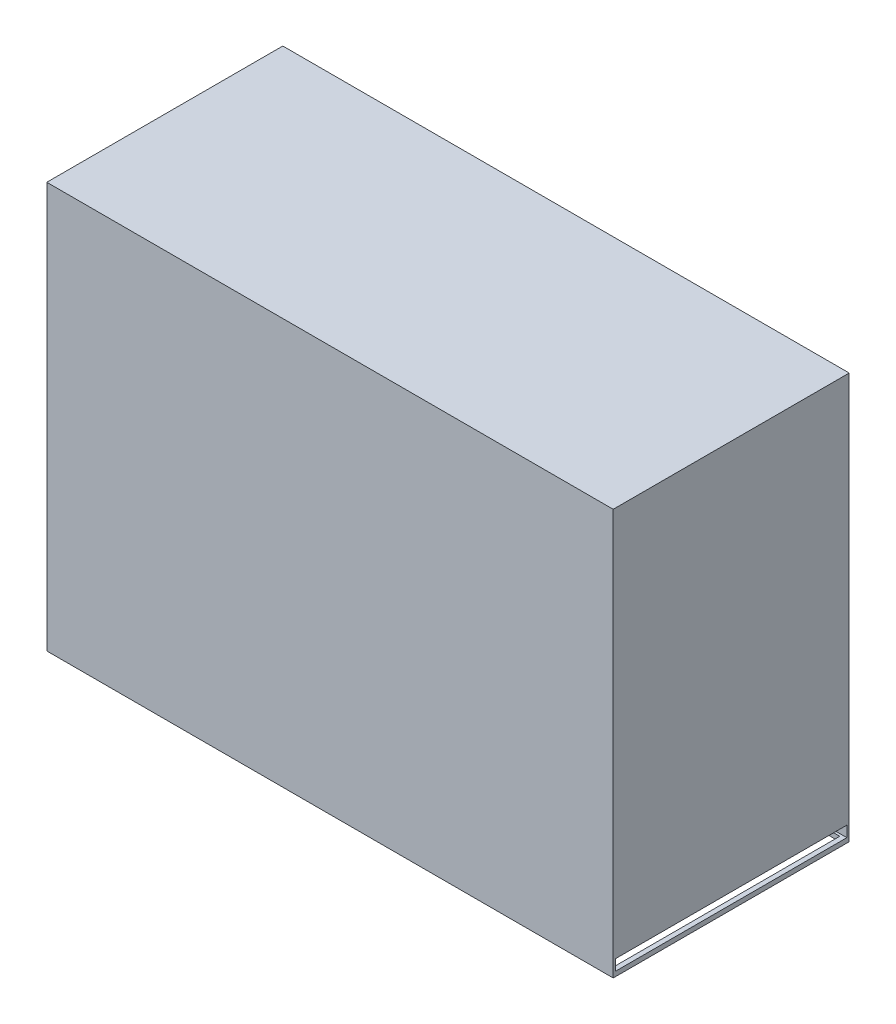
ISO-10303-21;
HEADER;
FILE_DESCRIPTION(('STEP AP214'),'2;1');
FILE_NAME('part.step','',(''),(''),'','','');
FILE_SCHEMA(('AUTOMOTIVE_DESIGN { 1 0 10303 214 1 1 1 1 }'));
ENDSEC;
DATA;
#1=APPLICATION_CONTEXT('core data for automotive mechanical design processes');
#2=APPLICATION_PROTOCOL_DEFINITION('international standard','automotive_design',2000,#1);
#3=PRODUCT_CONTEXT('',#1,'mechanical');
#4=PRODUCT('Part','Part','',(#3));
#5=PRODUCT_RELATED_PRODUCT_CATEGORY('part','',(#4));
#6=PRODUCT_DEFINITION_FORMATION('','',#4);
#7=PRODUCT_DEFINITION_CONTEXT('part definition',#1,'design');
#8=PRODUCT_DEFINITION('design','',#6,#7);
#9=PRODUCT_DEFINITION_SHAPE('','',#8);
#10=(LENGTH_UNIT() NAMED_UNIT(*) SI_UNIT(.MILLI.,.METRE.));
#11=(NAMED_UNIT(*) PLANE_ANGLE_UNIT() SI_UNIT($,.RADIAN.));
#12=(NAMED_UNIT(*) SI_UNIT($,.STERADIAN.) SOLID_ANGLE_UNIT());
#13=UNCERTAINTY_MEASURE_WITH_UNIT(LENGTH_MEASURE(1.E-05),#10,'distance_accuracy_value','');
#14=(GEOMETRIC_REPRESENTATION_CONTEXT(3) GLOBAL_UNCERTAINTY_ASSIGNED_CONTEXT((#13)) GLOBAL_UNIT_ASSIGNED_CONTEXT((#10,
#11,#12)) REPRESENTATION_CONTEXT('',''));
#15=CARTESIAN_POINT('',(0.,0.,0.));
#16=DIRECTION('',(0.,0.,1.));
#17=DIRECTION('',(1.,0.,0.));
#18=AXIS2_PLACEMENT_3D('',#15,#16,#17);
#19=CARTESIAN_POINT('',(1.,50.,49.));
#20=DIRECTION('',(0.,0.,1.));
#21=DIRECTION('',(1.,0.,0.));
#22=AXIS2_PLACEMENT_3D('',#19,#20,#21);
#23=PLANE('',#22);
#24=DIRECTION('',(0.,-1.,0.));
#25=VECTOR('',#24,1.);
#26=CARTESIAN_POINT('',(1.,50.,49.));
#27=LINE('',#26,#25);
#28=CARTESIAN_POINT('',(1.,-3.00000000000005,49.));
#29=VERTEX_POINT('',#28);
#30=CARTESIAN_POINT('',(1.,-4.,49.));
#31=VERTEX_POINT('',#30);
#32=EDGE_CURVE('E473',#29,#31,#27,.T.);
#33=ORIENTED_EDGE('',*,*,#32,.F.);
#34=DIRECTION('',(1.,0.,0.));
#35=VECTOR('',#34,1.);
#36=CARTESIAN_POINT('',(1.00000000000002,-3.00000000000004,49.));
#37=LINE('',#36,#35);
#38=CARTESIAN_POINT('',(119.,-3.,49.));
#39=VERTEX_POINT('',#38);
#40=EDGE_CURVE('E299',#29,#39,#37,.T.);
#41=ORIENTED_EDGE('',*,*,#40,.T.);
#42=DIRECTION('',(0.,-1.,0.));
#43=VECTOR('',#42,1.);
#44=CARTESIAN_POINT('',(119.,50.,49.));
#45=LINE('',#44,#43);
#46=CARTESIAN_POINT('',(119.,-4.,49.));
#47=VERTEX_POINT('',#46);
#48=EDGE_CURVE('E478',#39,#47,#45,.T.);
#49=ORIENTED_EDGE('',*,*,#48,.T.);
#50=DIRECTION('',(-1.,0.,0.));
#51=VECTOR('',#50,1.);
#52=CARTESIAN_POINT('',(1.,-4.,49.));
#53=LINE('',#52,#51);
#54=EDGE_CURVE('E315',#47,#31,#53,.T.);
#55=ORIENTED_EDGE('',*,*,#54,.T.);
#56=EDGE_LOOP('',(#33,#41,#49,#55));
#57=FACE_BOUND('',#56,.T.);
#58=ADVANCED_FACE('F41',(#57),#23,.F.);
#59=CARTESIAN_POINT('',(119.,50.,49.));
#60=DIRECTION('',(1.,0.,0.));
#61=DIRECTION('',(0.,0.,-1.));
#62=AXIS2_PLACEMENT_3D('',#59,#60,#61);
#63=PLANE('',#62);
#64=ORIENTED_EDGE('',*,*,#48,.F.);
#65=DIRECTION('',(0.,0.,-1.));
#66=VECTOR('',#65,1.);
#67=CARTESIAN_POINT('',(119.,-3.,49.));
#68=LINE('',#67,#66);
#69=CARTESIAN_POINT('',(119.,-3.,1.));
#70=VERTEX_POINT('',#69);
#71=EDGE_CURVE('E295',#39,#70,#68,.T.);
#72=ORIENTED_EDGE('',*,*,#71,.T.);
#73=DIRECTION('',(0.,-1.,0.));
#74=VECTOR('',#73,1.);
#75=CARTESIAN_POINT('',(119.,50.,1.));
#76=LINE('',#75,#74);
#77=CARTESIAN_POINT('',(119.,-4.,1.));
#78=VERTEX_POINT('',#77);
#79=EDGE_CURVE('E483',#70,#78,#76,.T.);
#80=ORIENTED_EDGE('',*,*,#79,.T.);
#81=DIRECTION('',(0.,0.,1.));
#82=VECTOR('',#81,1.);
#83=CARTESIAN_POINT('',(119.,-4.,49.));
#84=LINE('',#83,#82);
#85=EDGE_CURVE('E311',#78,#47,#84,.T.);
#86=ORIENTED_EDGE('',*,*,#85,.T.);
#87=EDGE_LOOP('',(#64,#72,#80,#86));
#88=FACE_BOUND('',#87,.T.);
#89=ADVANCED_FACE('F542',(#88),#63,.F.);
#90=CARTESIAN_POINT('',(1.00000000000001,50.,1.));
#91=DIRECTION('',(0.,0.,-1.));
#92=DIRECTION('',(-1.,0.,0.));
#93=AXIS2_PLACEMENT_3D('',#90,#91,#92);
#94=PLANE('',#93);
#95=ORIENTED_EDGE('',*,*,#79,.F.);
#96=DIRECTION('',(-1.,0.,0.));
#97=VECTOR('',#96,1.);
#98=CARTESIAN_POINT('',(1.00000000000002,-3.00000000000004,1.));
#99=LINE('',#98,#97);
#100=CARTESIAN_POINT('',(1.,-3.00000000000004,1.));
#101=VERTEX_POINT('',#100);
#102=EDGE_CURVE('E291',#70,#101,#99,.T.);
#103=ORIENTED_EDGE('',*,*,#102,.T.);
#104=DIRECTION('',(0.,-1.,0.));
#105=VECTOR('',#104,1.);
#106=CARTESIAN_POINT('',(1.00000000000001,50.,1.));
#107=LINE('',#106,#105);
#108=CARTESIAN_POINT('',(1.,-4.,1.));
#109=VERTEX_POINT('',#108);
#110=EDGE_CURVE('E468',#101,#109,#107,.T.);
#111=ORIENTED_EDGE('',*,*,#110,.T.);
#112=DIRECTION('',(1.,0.,0.));
#113=VECTOR('',#112,1.);
#114=CARTESIAN_POINT('',(1.,-4.,1.));
#115=LINE('',#114,#113);
#116=EDGE_CURVE('E307',#109,#78,#115,.T.);
#117=ORIENTED_EDGE('',*,*,#116,.T.);
#118=EDGE_LOOP('',(#95,#103,#111,#117));
#119=FACE_BOUND('',#118,.T.);
#120=ADVANCED_FACE('F549',(#119),#94,.F.);
#121=CARTESIAN_POINT('',(1.,50.,49.));
#122=DIRECTION('',(-1.,0.,0.));
#123=DIRECTION('',(0.,0.,1.));
#124=AXIS2_PLACEMENT_3D('',#121,#122,#123);
#125=PLANE('',#124);
#126=CARTESIAN_POINT('',(1.,50.,49.));
#127=VERTEX_POINT('',#126);
#128=CARTESIAN_POINT('',(1.,-0.700000000000046,49.));
#129=VERTEX_POINT('',#128);
#130=EDGE_CURVE('E469',#127,#129,#27,.T.);
#131=ORIENTED_EDGE('',*,*,#130,.T.);
#132=DIRECTION('',(0.,0.,1.));
#133=VECTOR('',#132,1.);
#134=CARTESIAN_POINT('',(1.,-0.700000000000041,0.5));
#135=LINE('',#134,#133);
#136=CARTESIAN_POINT('',(1.,-0.700000000000047,49.5));
#137=VERTEX_POINT('',#136);
#138=EDGE_CURVE('E243',#129,#137,#135,.T.);
#139=ORIENTED_EDGE('',*,*,#138,.T.);
#140=DIRECTION('',(0.,-1.,0.));
#141=VECTOR('',#140,1.);
#142=CARTESIAN_POINT('',(1.,-3.00000000000005,49.5));
#143=LINE('',#142,#141);
#144=CARTESIAN_POINT('',(1.,-3.00000000000005,49.5));
#145=VERTEX_POINT('',#144);
#146=EDGE_CURVE('E242',#137,#145,#143,.T.);
#147=ORIENTED_EDGE('',*,*,#146,.T.);
#148=DIRECTION('',(0.,0.,-1.));
#149=VECTOR('',#148,1.);
#150=CARTESIAN_POINT('',(1.,-3.00000000000004,0.5));
#151=LINE('',#150,#149);
#152=EDGE_CURVE('E235',#145,#29,#151,.T.);
#153=ORIENTED_EDGE('',*,*,#152,.T.);
#154=ORIENTED_EDGE('',*,*,#32,.T.);
#155=DIRECTION('',(0.,0.,-1.));
#156=VECTOR('',#155,1.);
#157=CARTESIAN_POINT('',(1.,-4.,49.));
#158=LINE('',#157,#156);
#159=EDGE_CURVE('E303',#31,#109,#158,.T.);
#160=ORIENTED_EDGE('',*,*,#159,.T.);
#161=ORIENTED_EDGE('',*,*,#110,.F.);
#162=CARTESIAN_POINT('',(1.,-3.00000000000004,0.5));
#163=VERTEX_POINT('',#162);
#164=EDGE_CURVE('E248',#101,#163,#151,.T.);
#165=ORIENTED_EDGE('',*,*,#164,.T.);
#166=DIRECTION('',(0.,1.,0.));
#167=VECTOR('',#166,1.);
#168=CARTESIAN_POINT('',(1.,-3.00000000000004,0.5));
#169=LINE('',#168,#167);
#170=CARTESIAN_POINT('',(1.,-0.700000000000041,0.5));
#171=VERTEX_POINT('',#170);
#172=EDGE_CURVE('E229',#163,#171,#169,.T.);
#173=ORIENTED_EDGE('',*,*,#172,.T.);
#174=CARTESIAN_POINT('',(1.00000000000001,-0.700000000000041,1.));
#175=VERTEX_POINT('',#174);
#176=EDGE_CURVE('E58',#171,#175,#135,.T.);
#177=ORIENTED_EDGE('',*,*,#176,.T.);
#178=CARTESIAN_POINT('',(1.00000000000001,50.,1.));
#179=VERTEX_POINT('',#178);
#180=EDGE_CURVE('E484',#179,#175,#107,.T.);
#181=ORIENTED_EDGE('',*,*,#180,.F.);
#182=DIRECTION('',(0.,0.,-1.));
#183=VECTOR('',#182,1.);
#184=CARTESIAN_POINT('',(1.,50.,49.));
#185=LINE('',#184,#183);
#186=CARTESIAN_POINT('',(1.00000000000001,50.,4.00000000000002));
#187=VERTEX_POINT('',#186);
#188=EDGE_CURVE('E450',#187,#179,#185,.T.);
#189=ORIENTED_EDGE('',*,*,#188,.F.);
#190=DIRECTION('',(0.,1.,0.));
#191=VECTOR('',#190,1.);
#192=CARTESIAN_POINT('',(1.00000000000001,48.15,4.00000000000002));
#193=LINE('',#192,#191);
#194=CARTESIAN_POINT('',(1.00000000000001,48.15,4.00000000000002));
#195=VERTEX_POINT('',#194);
#196=EDGE_CURVE('E353',#195,#187,#193,.T.);
#197=ORIENTED_EDGE('',*,*,#196,.F.);
#198=DIRECTION('',(0.,0.,-1.));
#199=VECTOR('',#198,1.);
#200=CARTESIAN_POINT('',(1.00000000000001,48.15,0.));
#201=LINE('',#200,#199);
#202=CARTESIAN_POINT('',(1.00000000000001,48.15,5.00000000000002));
#203=VERTEX_POINT('',#202);
#204=EDGE_CURVE('E335',#203,#195,#201,.T.);
#205=ORIENTED_EDGE('',*,*,#204,.F.);
#206=DIRECTION('',(0.,1.,0.));
#207=VECTOR('',#206,1.);
#208=CARTESIAN_POINT('',(1.00000000000001,48.15,5.00000000000002));
#209=LINE('',#208,#207);
#210=CARTESIAN_POINT('',(1.00000000000001,50.,5.00000000000002));
#211=VERTEX_POINT('',#210);
#212=EDGE_CURVE('E349',#203,#211,#209,.T.);
#213=ORIENTED_EDGE('',*,*,#212,.T.);
#214=CARTESIAN_POINT('',(1.,50.,29.));
#215=VERTEX_POINT('',#214);
#216=EDGE_CURVE('E451',#215,#211,#185,.T.);
#217=ORIENTED_EDGE('',*,*,#216,.F.);
#218=DIRECTION('',(0.,1.,0.));
#219=VECTOR('',#218,1.);
#220=CARTESIAN_POINT('',(1.,23.,29.));
#221=LINE('',#220,#219);
#222=CARTESIAN_POINT('',(1.,23.,29.));
#223=VERTEX_POINT('',#222);
#224=EDGE_CURVE('E447',#223,#215,#221,.T.);
#225=ORIENTED_EDGE('',*,*,#224,.F.);
#226=DIRECTION('',(0.,0.,-1.));
#227=VECTOR('',#226,1.);
#228=CARTESIAN_POINT('',(1.,23.,49.));
#229=LINE('',#228,#227);
#230=CARTESIAN_POINT('',(1.,23.,30.));
#231=VERTEX_POINT('',#230);
#232=EDGE_CURVE('E421',#231,#223,#229,.T.);
#233=ORIENTED_EDGE('',*,*,#232,.F.);
#234=DIRECTION('',(0.,-1.,0.));
#235=VECTOR('',#234,1.);
#236=CARTESIAN_POINT('',(1.,50.,30.));
#237=LINE('',#236,#235);
#238=CARTESIAN_POINT('',(1.,50.,30.));
#239=VERTEX_POINT('',#238);
#240=EDGE_CURVE('E411',#239,#231,#237,.T.);
#241=ORIENTED_EDGE('',*,*,#240,.F.);
#242=DIRECTION('',(0.,0.,-1.));
#243=VECTOR('',#242,1.);
#244=CARTESIAN_POINT('',(1.,50.,49.));
#245=LINE('',#244,#243);
#246=EDGE_CURVE('E401',#127,#239,#245,.T.);
#247=ORIENTED_EDGE('',*,*,#246,.F.);
#248=EDGE_LOOP('',(#131,#139,#147,#153,#154,#160,#161,#165,#173,#177,#181,#189,#197,#205,#213,
#217,#225,#233,#241,#247));
#249=FACE_BOUND('',#248,.T.);
#250=ADVANCED_FACE('F246',(#249),#125,.F.);
#251=CARTESIAN_POINT('',(0.,50.,0.));
#252=DIRECTION('',(0.,-1.,0.));
#253=DIRECTION('',(0.,0.,-1.));
#254=AXIS2_PLACEMENT_3D('',#251,#252,#253);
#255=PLANE('',#254);
#256=DIRECTION('',(-1.,0.,0.));
#257=VECTOR('',#256,1.);
#258=CARTESIAN_POINT('',(0.,50.,4.00000000000002));
#259=LINE('',#258,#257);
#260=CARTESIAN_POINT('',(119.,50.,4.00000000000002));
#261=VERTEX_POINT('',#260);
#262=EDGE_CURVE('E357',#261,#187,#259,.T.);
#263=ORIENTED_EDGE('',*,*,#262,.T.);
#264=ORIENTED_EDGE('',*,*,#188,.T.);
#265=DIRECTION('',(1.,0.,0.));
#266=VECTOR('',#265,1.);
#267=CARTESIAN_POINT('',(1.00000000000001,50.,1.));
#268=LINE('',#267,#266);
#269=CARTESIAN_POINT('',(119.,50.,1.));
#270=VERTEX_POINT('',#269);
#271=EDGE_CURVE('E455',#179,#270,#268,.T.);
#272=ORIENTED_EDGE('',*,*,#271,.T.);
#273=DIRECTION('',(0.,0.,1.));
#274=VECTOR('',#273,1.);
#275=CARTESIAN_POINT('',(119.,50.,49.));
#276=LINE('',#275,#274);
#277=EDGE_CURVE('E460',#270,#261,#276,.T.);
#278=ORIENTED_EDGE('',*,*,#277,.T.);
#279=EDGE_LOOP('',(#263,#264,#272,#278));
#280=FACE_BOUND('',#279,.T.);
#281=ADVANCED_FACE('F564',(#280),#255,.T.);
#282=ORIENTED_EDGE('',*,*,#216,.T.);
#283=DIRECTION('',(1.,0.,0.));
#284=VECTOR('',#283,1.);
#285=CARTESIAN_POINT('',(0.,50.,5.00000000000002));
#286=LINE('',#285,#284);
#287=CARTESIAN_POINT('',(119.,50.,5.00000000000001));
#288=VERTEX_POINT('',#287);
#289=EDGE_CURVE('E363',#211,#288,#286,.T.);
#290=ORIENTED_EDGE('',*,*,#289,.T.);
#291=CARTESIAN_POINT('',(119.,50.,49.));
#292=VERTEX_POINT('',#291);
#293=EDGE_CURVE('E459',#288,#292,#276,.T.);
#294=ORIENTED_EDGE('',*,*,#293,.T.);
#295=DIRECTION('',(-1.,0.,0.));
#296=VECTOR('',#295,1.);
#297=CARTESIAN_POINT('',(1.,50.,49.));
#298=LINE('',#297,#296);
#299=CARTESIAN_POINT('',(54.,50.,49.));
#300=VERTEX_POINT('',#299);
#301=EDGE_CURVE('E464',#292,#300,#298,.T.);
#302=ORIENTED_EDGE('',*,*,#301,.T.);
#303=DIRECTION('',(0.,0.,1.));
#304=VECTOR('',#303,1.);
#305=CARTESIAN_POINT('',(54.,50.,49.));
#306=LINE('',#305,#304);
#307=CARTESIAN_POINT('',(54.,50.,29.));
#308=VERTEX_POINT('',#307);
#309=EDGE_CURVE('E425',#308,#300,#306,.T.);
#310=ORIENTED_EDGE('',*,*,#309,.F.);
#311=DIRECTION('',(1.,0.,0.));
#312=VECTOR('',#311,1.);
#313=CARTESIAN_POINT('',(1.,50.,29.));
#314=LINE('',#313,#312);
#315=EDGE_CURVE('E414',#215,#308,#314,.T.);
#316=ORIENTED_EDGE('',*,*,#315,.F.);
#317=EDGE_LOOP('',(#282,#290,#294,#302,#310,#316));
#318=FACE_BOUND('',#317,.T.);
#319=ADVANCED_FACE('F557',(#318),#255,.T.);
#320=CARTESIAN_POINT('',(119.,-0.700000000000006,49.));
#321=VERTEX_POINT('',#320);
#322=EDGE_CURVE('E474',#292,#321,#45,.T.);
#323=ORIENTED_EDGE('',*,*,#322,.T.);
#324=DIRECTION('',(-1.,0.,0.));
#325=VECTOR('',#324,1.);
#326=CARTESIAN_POINT('',(1.00000000000002,-0.700000000000048,49.));
#327=LINE('',#326,#325);
#328=EDGE_CURVE('E287',#321,#129,#327,.T.);
#329=ORIENTED_EDGE('',*,*,#328,.T.);
#330=ORIENTED_EDGE('',*,*,#130,.F.);
#331=DIRECTION('',(1.,0.,0.));
#332=VECTOR('',#331,1.);
#333=CARTESIAN_POINT('',(1.,50.,49.));
#334=LINE('',#333,#332);
#335=CARTESIAN_POINT('',(53.,50.,49.));
#336=VERTEX_POINT('',#335);
#337=EDGE_CURVE('E398',#127,#336,#334,.T.);
#338=ORIENTED_EDGE('',*,*,#337,.T.);
#339=DIRECTION('',(0.,-1.,0.));
#340=VECTOR('',#339,1.);
#341=CARTESIAN_POINT('',(53.,50.,49.));
#342=LINE('',#341,#340);
#343=CARTESIAN_POINT('',(53.,23.,49.));
#344=VERTEX_POINT('',#343);
#345=EDGE_CURVE('E415',#336,#344,#342,.T.);
#346=ORIENTED_EDGE('',*,*,#345,.T.);
#347=DIRECTION('',(-1.,0.,0.));
#348=VECTOR('',#347,1.);
#349=CARTESIAN_POINT('',(1.,23.,49.));
#350=LINE('',#349,#348);
#351=CARTESIAN_POINT('',(54.,23.,49.));
#352=VERTEX_POINT('',#351);
#353=EDGE_CURVE('E431',#352,#344,#350,.T.);
#354=ORIENTED_EDGE('',*,*,#353,.F.);
#355=DIRECTION('',(0.,1.,0.));
#356=VECTOR('',#355,1.);
#357=CARTESIAN_POINT('',(54.,23.,49.));
#358=LINE('',#357,#356);
#359=EDGE_CURVE('E435',#352,#300,#358,.T.);
#360=ORIENTED_EDGE('',*,*,#359,.T.);
#361=ORIENTED_EDGE('',*,*,#301,.F.);
#362=EDGE_LOOP('',(#323,#329,#330,#338,#346,#354,#360,#361));
#363=FACE_BOUND('',#362,.T.);
#364=ADVANCED_FACE('F545',(#363),#23,.F.);
#365=CARTESIAN_POINT('',(0.,0.,50.));
#366=DIRECTION('',(0.,1.,0.));
#367=DIRECTION('',(0.,0.,1.));
#368=AXIS2_PLACEMENT_3D('',#365,#366,#367);
#369=PLANE('',#368);
#370=DIRECTION('',(-1.,0.,0.));
#371=VECTOR('',#370,1.);
#372=CARTESIAN_POINT('',(0.,0.,4.00000000000002));
#373=LINE('',#372,#371);
#374=CARTESIAN_POINT('',(119.,0.,4.00000000000002));
#375=VERTEX_POINT('',#374);
#376=CARTESIAN_POINT('',(114.,0.,4.00000000000002));
#377=VERTEX_POINT('',#376);
#378=EDGE_CURVE('E358',#375,#377,#373,.T.);
#379=ORIENTED_EDGE('',*,*,#378,.F.);
#380=DIRECTION('',(0.,0.,1.));
#381=VECTOR('',#380,1.);
#382=CARTESIAN_POINT('',(119.,0.,49.));
#383=LINE('',#382,#381);
#384=CARTESIAN_POINT('',(119.,0.,5.00000000000002));
#385=VERTEX_POINT('',#384);
#386=EDGE_CURVE('E11',#375,#385,#383,.T.);
#387=ORIENTED_EDGE('',*,*,#386,.T.);
#388=DIRECTION('',(1.,0.,0.));
#389=VECTOR('',#388,1.);
#390=CARTESIAN_POINT('',(0.,0.,5.00000000000002));
#391=LINE('',#390,#389);
#392=CARTESIAN_POINT('',(114.,0.,5.00000000000002));
#393=VERTEX_POINT('',#392);
#394=EDGE_CURVE('E362',#393,#385,#391,.T.);
#395=ORIENTED_EDGE('',*,*,#394,.F.);
#396=DIRECTION('',(0.,0.,-1.));
#397=VECTOR('',#396,1.);
#398=CARTESIAN_POINT('',(114.,0.,0.));
#399=LINE('',#398,#397);
#400=EDGE_CURVE('E367',#393,#377,#399,.T.);
#401=ORIENTED_EDGE('',*,*,#400,.T.);
#402=EDGE_LOOP('',(#379,#387,#395,#401));
#403=FACE_BOUND('',#402,.T.);
#404=ADVANCED_FACE('F556',(#403),#369,.F.);
#405=CARTESIAN_POINT('',(119.,-0.700000000000001,1.));
#406=VERTEX_POINT('',#405);
#407=EDGE_CURVE('E479',#270,#406,#76,.T.);
#408=ORIENTED_EDGE('',*,*,#407,.T.);
#409=DIRECTION('',(0.,0.,1.));
#410=VECTOR('',#409,1.);
#411=CARTESIAN_POINT('',(119.,-0.700000000000006,49.));
#412=LINE('',#411,#410);
#413=EDGE_CURVE('E283',#406,#321,#412,.T.);
#414=ORIENTED_EDGE('',*,*,#413,.T.);
#415=ORIENTED_EDGE('',*,*,#322,.F.);
#416=ORIENTED_EDGE('',*,*,#293,.F.);
#417=DIRECTION('',(0.,1.,0.));
#418=VECTOR('',#417,1.);
#419=CARTESIAN_POINT('',(119.,0.,5.00000000000002));
#420=LINE('',#419,#418);
#421=EDGE_CURVE('E382',#385,#288,#420,.T.);
#422=ORIENTED_EDGE('',*,*,#421,.F.);
#423=ORIENTED_EDGE('',*,*,#386,.F.);
#424=DIRECTION('',(0.,1.,0.));
#425=VECTOR('',#424,1.);
#426=CARTESIAN_POINT('',(119.,0.,4.00000000000002));
#427=LINE('',#426,#425);
#428=EDGE_CURVE('E386',#375,#261,#427,.T.);
#429=ORIENTED_EDGE('',*,*,#428,.T.);
#430=ORIENTED_EDGE('',*,*,#277,.F.);
#431=EDGE_LOOP('',(#408,#414,#415,#416,#422,#423,#429,#430));
#432=FACE_BOUND('',#431,.T.);
#433=ADVANCED_FACE('F552',(#432),#63,.F.);
#434=ORIENTED_EDGE('',*,*,#180,.T.);
#435=DIRECTION('',(1.,0.,0.));
#436=VECTOR('',#435,1.);
#437=CARTESIAN_POINT('',(1.00000000000002,-0.700000000000041,1.));
#438=LINE('',#437,#436);
#439=EDGE_CURVE('E239',#175,#406,#438,.T.);
#440=ORIENTED_EDGE('',*,*,#439,.T.);
#441=ORIENTED_EDGE('',*,*,#407,.F.);
#442=ORIENTED_EDGE('',*,*,#271,.F.);
#443=EDGE_LOOP('',(#434,#440,#441,#442));
#444=FACE_BOUND('',#443,.T.);
#445=ADVANCED_FACE('F573',(#444),#94,.F.);
#446=CARTESIAN_POINT('',(1.,23.,29.));
#447=DIRECTION('',(0.,0.,1.));
#448=DIRECTION('',(1.,0.,0.));
#449=AXIS2_PLACEMENT_3D('',#446,#447,#448);
#450=PLANE('',#449);
#451=ORIENTED_EDGE('',*,*,#315,.T.);
#452=DIRECTION('',(0.,1.,0.));
#453=VECTOR('',#452,1.);
#454=CARTESIAN_POINT('',(54.,23.,29.));
#455=LINE('',#454,#453);
#456=CARTESIAN_POINT('',(54.,23.,29.));
#457=VERTEX_POINT('',#456);
#458=EDGE_CURVE('E444',#457,#308,#455,.T.);
#459=ORIENTED_EDGE('',*,*,#458,.F.);
#460=DIRECTION('',(1.,0.,0.));
#461=VECTOR('',#460,1.);
#462=CARTESIAN_POINT('',(1.,23.,29.));
#463=LINE('',#462,#461);
#464=EDGE_CURVE('E424',#223,#457,#463,.T.);
#465=ORIENTED_EDGE('',*,*,#464,.F.);
#466=ORIENTED_EDGE('',*,*,#224,.T.);
#467=EDGE_LOOP('',(#451,#459,#465,#466));
#468=FACE_BOUND('',#467,.T.);
#469=ADVANCED_FACE('F623',(#468),#450,.F.);
#470=CARTESIAN_POINT('',(54.,23.,49.));
#471=DIRECTION('',(-1.,0.,0.));
#472=DIRECTION('',(0.,0.,1.));
#473=AXIS2_PLACEMENT_3D('',#470,#471,#472);
#474=PLANE('',#473);
#475=ORIENTED_EDGE('',*,*,#309,.T.);
#476=ORIENTED_EDGE('',*,*,#359,.F.);
#477=DIRECTION('',(0.,0.,1.));
#478=VECTOR('',#477,1.);
#479=CARTESIAN_POINT('',(54.,23.,49.));
#480=LINE('',#479,#478);
#481=EDGE_CURVE('E428',#457,#352,#480,.T.);
#482=ORIENTED_EDGE('',*,*,#481,.F.);
#483=ORIENTED_EDGE('',*,*,#458,.T.);
#484=EDGE_LOOP('',(#475,#476,#482,#483));
#485=FACE_BOUND('',#484,.T.);
#486=ADVANCED_FACE('F628',(#485),#474,.F.);
#487=CARTESIAN_POINT('',(0.,23.,0.));
#488=DIRECTION('',(0.,-1.,0.));
#489=DIRECTION('',(0.,0.,-1.));
#490=AXIS2_PLACEMENT_3D('',#487,#488,#489);
#491=PLANE('',#490);
#492=DIRECTION('',(1.,0.,0.));
#493=VECTOR('',#492,1.);
#494=CARTESIAN_POINT('',(1.,23.,30.));
#495=LINE('',#494,#493);
#496=CARTESIAN_POINT('',(53.,23.,30.));
#497=VERTEX_POINT('',#496);
#498=EDGE_CURVE('E389',#231,#497,#495,.T.);
#499=ORIENTED_EDGE('',*,*,#498,.F.);
#500=ORIENTED_EDGE('',*,*,#232,.T.);
#501=ORIENTED_EDGE('',*,*,#464,.T.);
#502=ORIENTED_EDGE('',*,*,#481,.T.);
#503=ORIENTED_EDGE('',*,*,#353,.T.);
#504=DIRECTION('',(0.,0.,-1.));
#505=VECTOR('',#504,1.);
#506=CARTESIAN_POINT('',(53.,23.,49.));
#507=LINE('',#506,#505);
#508=EDGE_CURVE('E395',#344,#497,#507,.T.);
#509=ORIENTED_EDGE('',*,*,#508,.T.);
#510=EDGE_LOOP('',(#499,#500,#501,#502,#503,#509));
#511=FACE_BOUND('',#510,.T.);
#512=ADVANCED_FACE('F617',(#511),#491,.T.);
#513=CARTESIAN_POINT('',(1.,50.,30.));
#514=DIRECTION('',(0.,0.,-1.));
#515=DIRECTION('',(-1.,0.,0.));
#516=AXIS2_PLACEMENT_3D('',#513,#514,#515);
#517=PLANE('',#516);
#518=ORIENTED_EDGE('',*,*,#498,.T.);
#519=DIRECTION('',(0.,-1.,0.));
#520=VECTOR('',#519,1.);
#521=CARTESIAN_POINT('',(53.,50.,30.));
#522=LINE('',#521,#520);
#523=CARTESIAN_POINT('',(53.,50.,30.));
#524=VERTEX_POINT('',#523);
#525=EDGE_CURVE('E405',#524,#497,#522,.T.);
#526=ORIENTED_EDGE('',*,*,#525,.F.);
#527=DIRECTION('',(1.,0.,0.));
#528=VECTOR('',#527,1.);
#529=CARTESIAN_POINT('',(1.,50.,30.));
#530=LINE('',#529,#528);
#531=EDGE_CURVE('E390',#239,#524,#530,.T.);
#532=ORIENTED_EDGE('',*,*,#531,.F.);
#533=ORIENTED_EDGE('',*,*,#240,.T.);
#534=EDGE_LOOP('',(#518,#526,#532,#533));
#535=FACE_BOUND('',#534,.T.);
#536=ADVANCED_FACE('F613',(#535),#517,.F.);
#537=CARTESIAN_POINT('',(53.,50.,49.));
#538=DIRECTION('',(-1.,0.,0.));
#539=DIRECTION('',(0.,0.,1.));
#540=AXIS2_PLACEMENT_3D('',#537,#538,#539);
#541=PLANE('',#540);
#542=ORIENTED_EDGE('',*,*,#508,.F.);
#543=ORIENTED_EDGE('',*,*,#345,.F.);
#544=DIRECTION('',(0.,0.,-1.));
#545=VECTOR('',#544,1.);
#546=CARTESIAN_POINT('',(53.,50.,49.));
#547=LINE('',#546,#545);
#548=EDGE_CURVE('E394',#336,#524,#547,.T.);
#549=ORIENTED_EDGE('',*,*,#548,.T.);
#550=ORIENTED_EDGE('',*,*,#525,.T.);
#551=EDGE_LOOP('',(#542,#543,#549,#550));
#552=FACE_BOUND('',#551,.T.);
#553=ADVANCED_FACE('F611',(#552),#541,.T.);
#554=CARTESIAN_POINT('',(0.,50.,0.));
#555=DIRECTION('',(0.,1.,0.));
#556=DIRECTION('',(0.,0.,1.));
#557=AXIS2_PLACEMENT_3D('',#554,#555,#556);
#558=PLANE('',#557);
#559=ORIENTED_EDGE('',*,*,#531,.T.);
#560=ORIENTED_EDGE('',*,*,#548,.F.);
#561=ORIENTED_EDGE('',*,*,#337,.F.);
#562=ORIENTED_EDGE('',*,*,#246,.T.);
#563=EDGE_LOOP('',(#559,#560,#561,#562));
#564=FACE_BOUND('',#563,.T.);
#565=ADVANCED_FACE('F606',(#564),#558,.F.);
#566=CARTESIAN_POINT('',(0.,0.,4.00000000000002));
#567=DIRECTION('',(0.,0.,-1.));
#568=DIRECTION('',(-1.,0.,0.));
#569=AXIS2_PLACEMENT_3D('',#566,#567,#568);
#570=PLANE('',#569);
#571=ORIENTED_EDGE('',*,*,#262,.F.);
#572=ORIENTED_EDGE('',*,*,#428,.F.);
#573=ORIENTED_EDGE('',*,*,#378,.T.);
#574=DIRECTION('',(0.,1.,0.));
#575=VECTOR('',#574,1.);
#576=CARTESIAN_POINT('',(114.,0.,4.00000000000002));
#577=LINE('',#576,#575);
#578=CARTESIAN_POINT('',(114.,48.15,4.00000000000002));
#579=VERTEX_POINT('',#578);
#580=EDGE_CURVE('E370',#377,#579,#577,.T.);
#581=ORIENTED_EDGE('',*,*,#580,.T.);
#582=DIRECTION('',(1.,0.,0.));
#583=VECTOR('',#582,1.);
#584=CARTESIAN_POINT('',(0.,48.15,4.00000000000002));
#585=LINE('',#584,#583);
#586=EDGE_CURVE('E339',#195,#579,#585,.T.);
#587=ORIENTED_EDGE('',*,*,#586,.F.);
#588=ORIENTED_EDGE('',*,*,#196,.T.);
#589=EDGE_LOOP('',(#571,#572,#573,#581,#587,#588));
#590=FACE_BOUND('',#589,.T.);
#591=ADVANCED_FACE('F648',(#590),#570,.T.);
#592=CARTESIAN_POINT('',(0.,0.,5.00000000000002));
#593=DIRECTION('',(0.,0.,1.));
#594=DIRECTION('',(1.,0.,0.));
#595=AXIS2_PLACEMENT_3D('',#592,#593,#594);
#596=PLANE('',#595);
#597=ORIENTED_EDGE('',*,*,#289,.F.);
#598=ORIENTED_EDGE('',*,*,#212,.F.);
#599=DIRECTION('',(-1.,0.,0.));
#600=VECTOR('',#599,1.);
#601=CARTESIAN_POINT('',(0.,48.15,5.00000000000002));
#602=LINE('',#601,#600);
#603=CARTESIAN_POINT('',(114.,48.15,5.00000000000002));
#604=VERTEX_POINT('',#603);
#605=EDGE_CURVE('E346',#604,#203,#602,.T.);
#606=ORIENTED_EDGE('',*,*,#605,.F.);
#607=DIRECTION('',(0.,1.,0.));
#608=VECTOR('',#607,1.);
#609=CARTESIAN_POINT('',(114.,0.,5.00000000000002));
#610=LINE('',#609,#608);
#611=EDGE_CURVE('E378',#393,#604,#610,.T.);
#612=ORIENTED_EDGE('',*,*,#611,.F.);
#613=ORIENTED_EDGE('',*,*,#394,.T.);
#614=ORIENTED_EDGE('',*,*,#421,.T.);
#615=EDGE_LOOP('',(#597,#598,#606,#612,#613,#614));
#616=FACE_BOUND('',#615,.T.);
#617=ADVANCED_FACE('F655',(#616),#596,.T.);
#618=CARTESIAN_POINT('',(114.,0.,0.));
#619=DIRECTION('',(1.,0.,0.));
#620=DIRECTION('',(0.,0.,-1.));
#621=AXIS2_PLACEMENT_3D('',#618,#619,#620);
#622=PLANE('',#621);
#623=ORIENTED_EDGE('',*,*,#611,.T.);
#624=DIRECTION('',(0.,0.,-1.));
#625=VECTOR('',#624,1.);
#626=CARTESIAN_POINT('',(114.,48.15,0.));
#627=LINE('',#626,#625);
#628=EDGE_CURVE('E342',#604,#579,#627,.T.);
#629=ORIENTED_EDGE('',*,*,#628,.T.);
#630=ORIENTED_EDGE('',*,*,#580,.F.);
#631=ORIENTED_EDGE('',*,*,#400,.F.);
#632=EDGE_LOOP('',(#623,#629,#630,#631));
#633=FACE_BOUND('',#632,.T.);
#634=ADVANCED_FACE('F660',(#633),#622,.F.);
#635=CARTESIAN_POINT('',(0.,48.15,0.));
#636=DIRECTION('',(0.,-1.,0.));
#637=DIRECTION('',(0.,0.,-1.));
#638=AXIS2_PLACEMENT_3D('',#635,#636,#637);
#639=PLANE('',#638);
#640=ORIENTED_EDGE('',*,*,#204,.T.);
#641=ORIENTED_EDGE('',*,*,#586,.T.);
#642=ORIENTED_EDGE('',*,*,#628,.F.);
#643=ORIENTED_EDGE('',*,*,#605,.T.);
#644=EDGE_LOOP('',(#640,#641,#642,#643));
#645=FACE_BOUND('',#644,.T.);
#646=ADVANCED_FACE('F652',(#645),#639,.T.);
#647=CARTESIAN_POINT('',(0.,-4.,0.));
#648=DIRECTION('',(0.,-1.,0.));
#649=DIRECTION('',(0.,0.,-1.));
#650=AXIS2_PLACEMENT_3D('',#647,#648,#649);
#651=PLANE('',#650);
#652=DIRECTION('',(0.,0.,-1.));
#653=VECTOR('',#652,1.);
#654=CARTESIAN_POINT('',(0.,-4.,50.));
#655=LINE('',#654,#653);
#656=CARTESIAN_POINT('',(0.,-4.,50.));
#657=VERTEX_POINT('',#656);
#658=CARTESIAN_POINT('',(0.,-4.,0.));
#659=VERTEX_POINT('',#658);
#660=EDGE_CURVE('E318',#657,#659,#655,.T.);
#661=ORIENTED_EDGE('',*,*,#660,.T.);
#662=DIRECTION('',(1.,0.,0.));
#663=VECTOR('',#662,1.);
#664=CARTESIAN_POINT('',(0.,-4.,0.));
#665=LINE('',#664,#663);
#666=CARTESIAN_POINT('',(120.,-4.,0.));
#667=VERTEX_POINT('',#666);
#668=EDGE_CURVE('E323',#659,#667,#665,.T.);
#669=ORIENTED_EDGE('',*,*,#668,.T.);
#670=DIRECTION('',(0.,0.,1.));
#671=VECTOR('',#670,1.);
#672=CARTESIAN_POINT('',(120.,-4.,50.));
#673=LINE('',#672,#671);
#674=CARTESIAN_POINT('',(120.,-4.,50.));
#675=VERTEX_POINT('',#674);
#676=EDGE_CURVE('E327',#667,#675,#673,.T.);
#677=ORIENTED_EDGE('',*,*,#676,.T.);
#678=DIRECTION('',(-1.,0.,0.));
#679=VECTOR('',#678,1.);
#680=CARTESIAN_POINT('',(0.,-4.,50.));
#681=LINE('',#680,#679);
#682=EDGE_CURVE('E331',#675,#657,#681,.T.);
#683=ORIENTED_EDGE('',*,*,#682,.T.);
#684=EDGE_LOOP('',(#661,#669,#677,#683));
#685=FACE_BOUND('',#684,.T.);
#686=ORIENTED_EDGE('',*,*,#116,.F.);
#687=ORIENTED_EDGE('',*,*,#159,.F.);
#688=ORIENTED_EDGE('',*,*,#54,.F.);
#689=ORIENTED_EDGE('',*,*,#85,.F.);
#690=EDGE_LOOP('',(#686,#687,#688,#689));
#691=FACE_BOUND('',#690,.T.);
#692=ADVANCED_FACE('F523',(#685,#691),#651,.T.);
#693=CARTESIAN_POINT('',(0.,82.,50.));
#694=DIRECTION('',(0.,-1.,0.));
#695=DIRECTION('',(0.,0.,-1.));
#696=AXIS2_PLACEMENT_3D('',#693,#694,#695);
#697=PLANE('',#696);
#698=DIRECTION('',(-1.,0.,0.));
#699=VECTOR('',#698,1.);
#700=CARTESIAN_POINT('',(0.,82.,0.));
#701=LINE('',#700,#699);
#702=CARTESIAN_POINT('',(120.,82.,0.));
#703=VERTEX_POINT('',#702);
#704=CARTESIAN_POINT('',(0.,82.,0.));
#705=VERTEX_POINT('',#704);
#706=EDGE_CURVE('E491',#703,#705,#701,.T.);
#707=ORIENTED_EDGE('',*,*,#706,.T.);
#708=DIRECTION('',(0.,0.,-1.));
#709=VECTOR('',#708,1.);
#710=CARTESIAN_POINT('',(0.,82.,50.));
#711=LINE('',#710,#709);
#712=CARTESIAN_POINT('',(0.,82.,50.));
#713=VERTEX_POINT('',#712);
#714=EDGE_CURVE('E497',#713,#705,#711,.T.);
#715=ORIENTED_EDGE('',*,*,#714,.F.);
#716=DIRECTION('',(-1.,0.,0.));
#717=VECTOR('',#716,1.);
#718=CARTESIAN_POINT('',(0.,82.,50.));
#719=LINE('',#718,#717);
#720=CARTESIAN_POINT('',(120.,82.,50.));
#721=VERTEX_POINT('',#720);
#722=EDGE_CURVE('E494',#721,#713,#719,.T.);
#723=ORIENTED_EDGE('',*,*,#722,.F.);
#724=DIRECTION('',(0.,0.,-1.));
#725=VECTOR('',#724,1.);
#726=CARTESIAN_POINT('',(120.,82.,50.));
#727=LINE('',#726,#725);
#728=EDGE_CURVE('E45',#721,#703,#727,.T.);
#729=ORIENTED_EDGE('',*,*,#728,.T.);
#730=EDGE_LOOP('',(#707,#715,#723,#729));
#731=FACE_BOUND('',#730,.T.);
#732=ADVANCED_FACE('F516',(#731),#697,.F.);
#733=CARTESIAN_POINT('',(0.,0.,50.));
#734=DIRECTION('',(1.,0.,0.));
#735=DIRECTION('',(0.,1.,0.));
#736=AXIS2_PLACEMENT_3D('',#733,#734,#735);
#737=PLANE('',#736);
#738=DIRECTION('',(0.,-1.,0.));
#739=VECTOR('',#738,1.);
#740=CARTESIAN_POINT('',(0.,0.,0.));
#741=LINE('',#740,#739);
#742=EDGE_CURVE('E472',#705,#659,#741,.T.);
#743=ORIENTED_EDGE('',*,*,#742,.T.);
#744=ORIENTED_EDGE('',*,*,#660,.F.);
#745=DIRECTION('',(0.,-1.,0.));
#746=VECTOR('',#745,1.);
#747=CARTESIAN_POINT('',(0.,0.,50.));
#748=LINE('',#747,#746);
#749=EDGE_CURVE('E487',#713,#657,#748,.T.);
#750=ORIENTED_EDGE('',*,*,#749,.F.);
#751=ORIENTED_EDGE('',*,*,#714,.T.);
#752=EDGE_LOOP('',(#743,#744,#750,#751));
#753=FACE_BOUND('',#752,.T.);
#754=ADVANCED_FACE('F43',(#753),#737,.F.);
#755=CARTESIAN_POINT('',(0.,0.,50.));
#756=DIRECTION('',(0.,0.,-1.));
#757=DIRECTION('',(-1.,0.,0.));
#758=AXIS2_PLACEMENT_3D('',#755,#756,#757);
#759=PLANE('',#758);
#760=ORIENTED_EDGE('',*,*,#749,.T.);
#761=ORIENTED_EDGE('',*,*,#682,.F.);
#762=DIRECTION('',(0.,1.,0.));
#763=VECTOR('',#762,1.);
#764=CARTESIAN_POINT('',(120.,0.,50.));
#765=LINE('',#764,#763);
#766=EDGE_CURVE('E490',#675,#721,#765,.T.);
#767=ORIENTED_EDGE('',*,*,#766,.T.);
#768=ORIENTED_EDGE('',*,*,#722,.T.);
#769=EDGE_LOOP('',(#760,#761,#767,#768));
#770=FACE_BOUND('',#769,.T.);
#771=ADVANCED_FACE('F528',(#770),#759,.F.);
#772=CARTESIAN_POINT('',(120.,0.,50.));
#773=DIRECTION('',(-1.,0.,0.));
#774=DIRECTION('',(0.,-1.,0.));
#775=AXIS2_PLACEMENT_3D('',#772,#773,#774);
#776=PLANE('',#775);
#777=DIRECTION('',(0.,0.,1.));
#778=VECTOR('',#777,1.);
#779=CARTESIAN_POINT('',(120.,-0.7,0.5));
#780=LINE('',#779,#778);
#781=CARTESIAN_POINT('',(120.,-0.7,0.5));
#782=VERTEX_POINT('',#781);
#783=CARTESIAN_POINT('',(120.,-0.700000000000006,49.5));
#784=VERTEX_POINT('',#783);
#785=EDGE_CURVE('E267',#782,#784,#780,.T.);
#786=ORIENTED_EDGE('',*,*,#785,.F.);
#787=DIRECTION('',(0.,1.,0.));
#788=VECTOR('',#787,1.);
#789=CARTESIAN_POINT('',(120.,-3.,0.5));
#790=LINE('',#789,#788);
#791=CARTESIAN_POINT('',(120.,-3.,0.5));
#792=VERTEX_POINT('',#791);
#793=EDGE_CURVE('E66',#792,#782,#790,.T.);
#794=ORIENTED_EDGE('',*,*,#793,.F.);
#795=DIRECTION('',(0.,0.,-1.));
#796=VECTOR('',#795,1.);
#797=CARTESIAN_POINT('',(120.,-3.,0.5));
#798=LINE('',#797,#796);
#799=CARTESIAN_POINT('',(120.,-3.00000000000001,49.5));
#800=VERTEX_POINT('',#799);
#801=EDGE_CURVE('E251',#800,#792,#798,.T.);
#802=ORIENTED_EDGE('',*,*,#801,.F.);
#803=DIRECTION('',(0.,-1.,0.));
#804=VECTOR('',#803,1.);
#805=CARTESIAN_POINT('',(120.,-3.00000000000001,49.5));
#806=LINE('',#805,#804);
#807=EDGE_CURVE('E256',#784,#800,#806,.T.);
#808=ORIENTED_EDGE('',*,*,#807,.F.);
#809=EDGE_LOOP('',(#786,#794,#802,#808));
#810=FACE_BOUND('',#809,.T.);
#811=DIRECTION('',(0.,1.,0.));
#812=VECTOR('',#811,1.);
#813=CARTESIAN_POINT('',(120.,0.,0.));
#814=LINE('',#813,#812);
#815=EDGE_CURVE('E500',#667,#703,#814,.T.);
#816=ORIENTED_EDGE('',*,*,#815,.T.);
#817=ORIENTED_EDGE('',*,*,#728,.F.);
#818=ORIENTED_EDGE('',*,*,#766,.F.);
#819=ORIENTED_EDGE('',*,*,#676,.F.);
#820=EDGE_LOOP('',(#816,#817,#818,#819));
#821=FACE_BOUND('',#820,.T.);
#822=ADVANCED_FACE('F529',(#810,#821),#776,.F.);
#823=CARTESIAN_POINT('',(0.,0.,0.));
#824=DIRECTION('',(0.,0.,-1.));
#825=DIRECTION('',(-1.,0.,0.));
#826=AXIS2_PLACEMENT_3D('',#823,#824,#825);
#827=PLANE('',#826);
#828=ORIENTED_EDGE('',*,*,#742,.F.);
#829=ORIENTED_EDGE('',*,*,#706,.F.);
#830=ORIENTED_EDGE('',*,*,#815,.F.);
#831=ORIENTED_EDGE('',*,*,#668,.F.);
#832=EDGE_LOOP('',(#828,#829,#830,#831));
#833=FACE_BOUND('',#832,.T.);
#834=ADVANCED_FACE('F519',(#833),#827,.T.);
#835=CARTESIAN_POINT('',(1.,-3.00000000000004,0.5));
#836=DIRECTION('',(0.,-1.,0.));
#837=DIRECTION('',(1.,0.,0.));
#838=AXIS2_PLACEMENT_3D('',#835,#836,#837);
#839=PLANE('',#838);
#840=ORIENTED_EDGE('',*,*,#152,.F.);
#841=DIRECTION('',(1.,0.,0.));
#842=VECTOR('',#841,1.);
#843=CARTESIAN_POINT('',(1.,-3.00000000000005,49.5));
#844=LINE('',#843,#842);
#845=EDGE_CURVE('E276',#145,#800,#844,.T.);
#846=ORIENTED_EDGE('',*,*,#845,.T.);
#847=ORIENTED_EDGE('',*,*,#801,.T.);
#848=DIRECTION('',(1.,0.,0.));
#849=VECTOR('',#848,1.);
#850=CARTESIAN_POINT('',(1.,-3.00000000000004,0.5));
#851=LINE('',#850,#849);
#852=EDGE_CURVE('E273',#163,#792,#851,.T.);
#853=ORIENTED_EDGE('',*,*,#852,.F.);
#854=ORIENTED_EDGE('',*,*,#164,.F.);
#855=ORIENTED_EDGE('',*,*,#102,.F.);
#856=ORIENTED_EDGE('',*,*,#71,.F.);
#857=ORIENTED_EDGE('',*,*,#40,.F.);
#858=EDGE_LOOP('',(#840,#846,#847,#853,#854,#855,#856,#857));
#859=FACE_BOUND('',#858,.T.);
#860=ADVANCED_FACE('F537',(#859),#839,.F.);
#861=CARTESIAN_POINT('',(1.,-0.700000000000041,0.5));
#862=DIRECTION('',(0.,1.,0.));
#863=DIRECTION('',(-1.,0.,0.));
#864=AXIS2_PLACEMENT_3D('',#861,#862,#863);
#865=PLANE('',#864);
#866=ORIENTED_EDGE('',*,*,#413,.F.);
#867=ORIENTED_EDGE('',*,*,#439,.F.);
#868=ORIENTED_EDGE('',*,*,#176,.F.);
#869=DIRECTION('',(1.,0.,0.));
#870=VECTOR('',#869,1.);
#871=CARTESIAN_POINT('',(1.,-0.700000000000041,0.5));
#872=LINE('',#871,#870);
#873=EDGE_CURVE('E227',#171,#782,#872,.T.);
#874=ORIENTED_EDGE('',*,*,#873,.T.);
#875=ORIENTED_EDGE('',*,*,#785,.T.);
#876=DIRECTION('',(1.,0.,0.));
#877=VECTOR('',#876,1.);
#878=CARTESIAN_POINT('',(1.,-0.700000000000047,49.5));
#879=LINE('',#878,#877);
#880=EDGE_CURVE('E234',#137,#784,#879,.T.);
#881=ORIENTED_EDGE('',*,*,#880,.F.);
#882=ORIENTED_EDGE('',*,*,#138,.F.);
#883=ORIENTED_EDGE('',*,*,#328,.F.);
#884=EDGE_LOOP('',(#866,#867,#868,#874,#875,#881,#882,#883));
#885=FACE_BOUND('',#884,.T.);
#886=ADVANCED_FACE('F237',(#885),#865,.F.);
#887=CARTESIAN_POINT('',(1.,-3.00000000000004,0.5));
#888=DIRECTION('',(0.,0.,-1.));
#889=DIRECTION('',(-1.,0.,0.));
#890=AXIS2_PLACEMENT_3D('',#887,#888,#889);
#891=PLANE('',#890);
#892=ORIENTED_EDGE('',*,*,#793,.T.);
#893=ORIENTED_EDGE('',*,*,#873,.F.);
#894=ORIENTED_EDGE('',*,*,#172,.F.);
#895=ORIENTED_EDGE('',*,*,#852,.T.);
#896=EDGE_LOOP('',(#892,#893,#894,#895));
#897=FACE_BOUND('',#896,.T.);
#898=ADVANCED_FACE('F228',(#897),#891,.F.);
#899=CARTESIAN_POINT('',(1.,-3.00000000000005,49.5));
#900=DIRECTION('',(0.,0.,1.));
#901=DIRECTION('',(1.,0.,0.));
#902=AXIS2_PLACEMENT_3D('',#899,#900,#901);
#903=PLANE('',#902);
#904=ORIENTED_EDGE('',*,*,#807,.T.);
#905=ORIENTED_EDGE('',*,*,#845,.F.);
#906=ORIENTED_EDGE('',*,*,#146,.F.);
#907=ORIENTED_EDGE('',*,*,#880,.T.);
#908=EDGE_LOOP('',(#904,#905,#906,#907));
#909=FACE_BOUND('',#908,.T.);
#910=ADVANCED_FACE('F600',(#909),#903,.F.);
#911=CLOSED_SHELL('',(#58,#89,#120,#250,#281,#319,#364,#404,#433,#445,#469,#486,#512,#536,#553,
#565,#591,#617,#634,#646,#692,#732,#754,#771,#822,#834,#860,#886,#898,#910));
#912=MANIFOLD_SOLID_BREP('B2',#911);
#913=ADVANCED_BREP_SHAPE_REPRESENTATION('',(#18,#912),#14);
#914=SHAPE_DEFINITION_REPRESENTATION(#9,#913);
ENDSEC;
END-ISO-10303-21;
